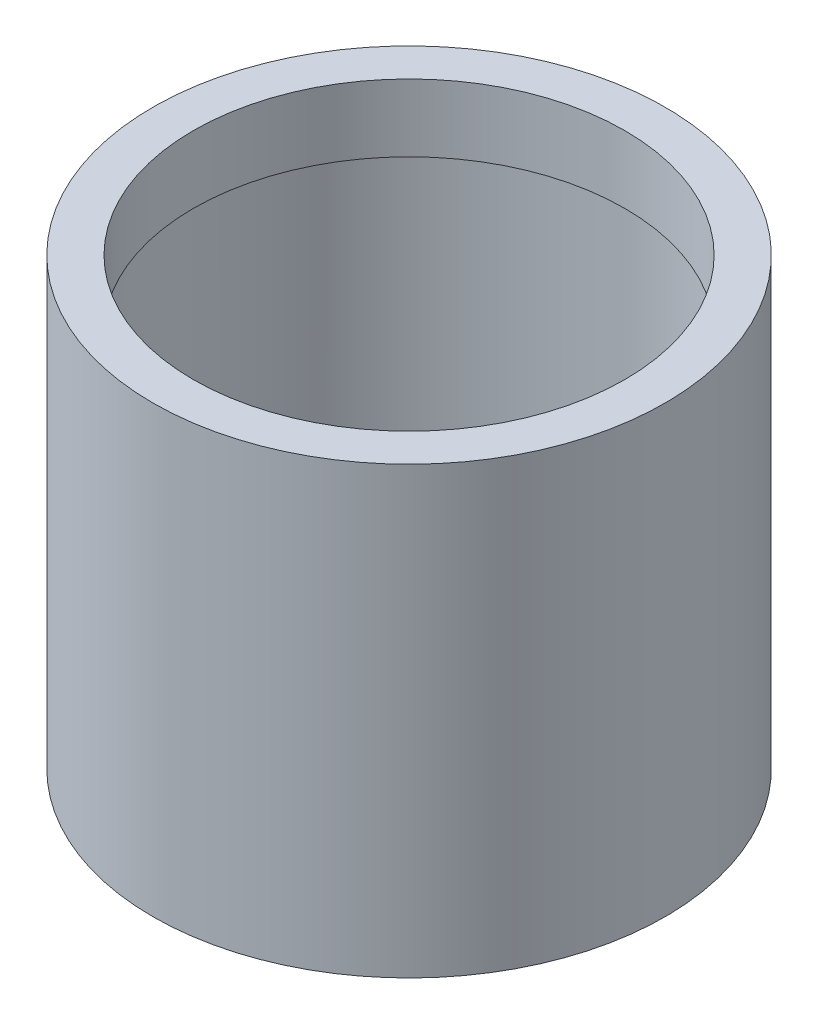
ISO-10303-21;
HEADER;
FILE_DESCRIPTION(('STEP AP214'),'2;1');
FILE_NAME('part.step','',(''),(''),'','','');
FILE_SCHEMA(('AUTOMOTIVE_DESIGN { 1 0 10303 214 1 1 1 1 }'));
ENDSEC;
DATA;
#1=APPLICATION_CONTEXT('core data for automotive mechanical design processes');
#2=APPLICATION_PROTOCOL_DEFINITION('international standard','automotive_design',2000,#1);
#3=PRODUCT_CONTEXT('',#1,'mechanical');
#4=PRODUCT('Part','Part','',(#3));
#5=PRODUCT_RELATED_PRODUCT_CATEGORY('part','',(#4));
#6=PRODUCT_DEFINITION_FORMATION('','',#4);
#7=PRODUCT_DEFINITION_CONTEXT('part definition',#1,'design');
#8=PRODUCT_DEFINITION('design','',#6,#7);
#9=PRODUCT_DEFINITION_SHAPE('','',#8);
#10=(LENGTH_UNIT() NAMED_UNIT(*) SI_UNIT(.MILLI.,.METRE.));
#11=(NAMED_UNIT(*) PLANE_ANGLE_UNIT() SI_UNIT($,.RADIAN.));
#12=(NAMED_UNIT(*) SI_UNIT($,.STERADIAN.) SOLID_ANGLE_UNIT());
#13=UNCERTAINTY_MEASURE_WITH_UNIT(LENGTH_MEASURE(1.E-05),#10,'distance_accuracy_value','');
#14=(GEOMETRIC_REPRESENTATION_CONTEXT(3) GLOBAL_UNCERTAINTY_ASSIGNED_CONTEXT((#13)) GLOBAL_UNIT_ASSIGNED_CONTEXT((#10,
#11,#12)) REPRESENTATION_CONTEXT('',''));
#15=CARTESIAN_POINT('',(0.,0.,0.));
#16=DIRECTION('',(0.,0.,1.));
#17=DIRECTION('',(1.,0.,0.));
#18=AXIS2_PLACEMENT_3D('',#15,#16,#17);
#19=CARTESIAN_POINT('',(0.,33.,0.));
#20=DIRECTION('',(0.,-1.,0.));
#21=DIRECTION('',(0.,0.,-1.));
#22=AXIS2_PLACEMENT_3D('',#19,#20,#21);
#23=CYLINDRICAL_SURFACE('',#22,19.);
#24=CARTESIAN_POINT('',(0.,33.,0.));
#25=DIRECTION('',(0.,1.,0.));
#26=DIRECTION('',(0.,0.,1.));
#27=AXIS2_PLACEMENT_3D('',#24,#25,#26);
#28=CIRCLE('',#27,19.);
#29=CARTESIAN_POINT('',(0.,33.,19.));
#30=VERTEX_POINT('',#29);
#31=EDGE_CURVE('E10',#30,#30,#28,.T.);
#32=ORIENTED_EDGE('',*,*,#31,.F.);
#33=EDGE_LOOP('',(#32));
#34=FACE_BOUND('',#33,.T.);
#35=CARTESIAN_POINT('',(0.,0.,0.));
#36=DIRECTION('',(0.,1.,0.));
#37=DIRECTION('',(0.,0.,1.));
#38=AXIS2_PLACEMENT_3D('',#35,#36,#37);
#39=CIRCLE('',#38,19.);
#40=CARTESIAN_POINT('',(0.,0.,19.));
#41=VERTEX_POINT('',#40);
#42=EDGE_CURVE('E36',#41,#41,#39,.T.);
#43=ORIENTED_EDGE('',*,*,#42,.T.);
#44=EDGE_LOOP('',(#43));
#45=FACE_BOUND('',#44,.T.);
#46=ADVANCED_FACE('F33',(#34,#45),#23,.T.);
#47=CARTESIAN_POINT('',(0.,33.,0.));
#48=DIRECTION('',(0.,1.,0.));
#49=DIRECTION('',(0.,0.,1.));
#50=AXIS2_PLACEMENT_3D('',#47,#48,#49);
#51=PLANE('',#50);
#52=CARTESIAN_POINT('',(0.,33.,0.));
#53=DIRECTION('',(0.,1.,0.));
#54=DIRECTION('',(0.,0.,1.));
#55=AXIS2_PLACEMENT_3D('',#52,#53,#54);
#56=CIRCLE('',#55,16.);
#57=CARTESIAN_POINT('',(0.,33.,16.));
#58=VERTEX_POINT('',#57);
#59=EDGE_CURVE('E43',#58,#58,#56,.T.);
#60=ORIENTED_EDGE('',*,*,#59,.F.);
#61=EDGE_LOOP('',(#60));
#62=FACE_BOUND('',#61,.T.);
#63=ORIENTED_EDGE('',*,*,#31,.T.);
#64=EDGE_LOOP('',(#63));
#65=FACE_BOUND('',#64,.T.);
#66=ADVANCED_FACE('F64',(#62,#65),#51,.T.);
#67=CARTESIAN_POINT('',(0.,0.,0.));
#68=DIRECTION('',(0.,1.,0.));
#69=DIRECTION('',(0.,0.,1.));
#70=AXIS2_PLACEMENT_3D('',#67,#68,#69);
#71=PLANE('',#70);
#72=CARTESIAN_POINT('',(0.,0.,0.));
#73=DIRECTION('',(0.,-1.,0.));
#74=DIRECTION('',(0.,0.,-1.));
#75=AXIS2_PLACEMENT_3D('',#72,#73,#74);
#76=CIRCLE('',#75,17.5);
#77=CARTESIAN_POINT('',(0.,0.,-17.5));
#78=VERTEX_POINT('',#77);
#79=EDGE_CURVE('E53',#78,#78,#76,.T.);
#80=ORIENTED_EDGE('',*,*,#79,.F.);
#81=EDGE_LOOP('',(#80));
#82=FACE_BOUND('',#81,.T.);
#83=ORIENTED_EDGE('',*,*,#42,.F.);
#84=EDGE_LOOP('',(#83));
#85=FACE_BOUND('',#84,.T.);
#86=ADVANCED_FACE('F60',(#82,#85),#71,.F.);
#87=CARTESIAN_POINT('',(0.,28.,0.));
#88=DIRECTION('',(0.,1.,0.));
#89=DIRECTION('',(0.,0.,1.));
#90=AXIS2_PLACEMENT_3D('',#87,#88,#89);
#91=CYLINDRICAL_SURFACE('',#90,16.);
#92=CARTESIAN_POINT('',(0.,28.,0.));
#93=DIRECTION('',(0.,1.,0.));
#94=DIRECTION('',(0.,0.,1.));
#95=AXIS2_PLACEMENT_3D('',#92,#93,#94);
#96=CIRCLE('',#95,16.);
#97=CARTESIAN_POINT('',(0.,28.,16.));
#98=VERTEX_POINT('',#97);
#99=EDGE_CURVE('E47',#98,#98,#96,.T.);
#100=ORIENTED_EDGE('',*,*,#99,.F.);
#101=EDGE_LOOP('',(#100));
#102=FACE_BOUND('',#101,.T.);
#103=ORIENTED_EDGE('',*,*,#59,.T.);
#104=EDGE_LOOP('',(#103));
#105=FACE_BOUND('',#104,.T.);
#106=ADVANCED_FACE('F63',(#102,#105),#91,.F.);
#107=CARTESIAN_POINT('',(0.,28.,0.));
#108=DIRECTION('',(0.,1.,0.));
#109=DIRECTION('',(0.,0.,1.));
#110=AXIS2_PLACEMENT_3D('',#107,#108,#109);
#111=PLANE('',#110);
#112=ORIENTED_EDGE('',*,*,#99,.T.);
#113=EDGE_LOOP('',(#112));
#114=FACE_BOUND('',#113,.T.);
#115=CARTESIAN_POINT('',(0.,28.,0.));
#116=DIRECTION('',(0.,1.,0.));
#117=DIRECTION('',(0.,0.,1.));
#118=AXIS2_PLACEMENT_3D('',#115,#116,#117);
#119=CIRCLE('',#118,17.5);
#120=CARTESIAN_POINT('',(0.,28.,17.5));
#121=VERTEX_POINT('',#120);
#122=EDGE_CURVE('E50',#121,#121,#119,.F.);
#123=ORIENTED_EDGE('',*,*,#122,.T.);
#124=EDGE_LOOP('',(#123));
#125=FACE_BOUND('',#124,.T.);
#126=ADVANCED_FACE('F80',(#114,#125),#111,.F.);
#127=CARTESIAN_POINT('',(0.,77.4974746830583,0.));
#128=DIRECTION('',(0.,-1.,0.));
#129=DIRECTION('',(0.,0.,-1.));
#130=AXIS2_PLACEMENT_3D('',#127,#128,#129);
#131=CYLINDRICAL_SURFACE('',#130,17.5);
#132=ORIENTED_EDGE('',*,*,#79,.T.);
#133=EDGE_LOOP('',(#132));
#134=FACE_BOUND('',#133,.T.);
#135=ORIENTED_EDGE('',*,*,#122,.F.);
#136=EDGE_LOOP('',(#135));
#137=FACE_BOUND('',#136,.T.);
#138=ADVANCED_FACE('F57',(#134,#137),#131,.F.);
#139=CLOSED_SHELL('',(#46,#66,#86,#106,#126,#138));
#140=MANIFOLD_SOLID_BREP('B2',#139);
#141=ADVANCED_BREP_SHAPE_REPRESENTATION('',(#18,#140),#14);
#142=SHAPE_DEFINITION_REPRESENTATION(#9,#141);
ENDSEC;
END-ISO-10303-21;
